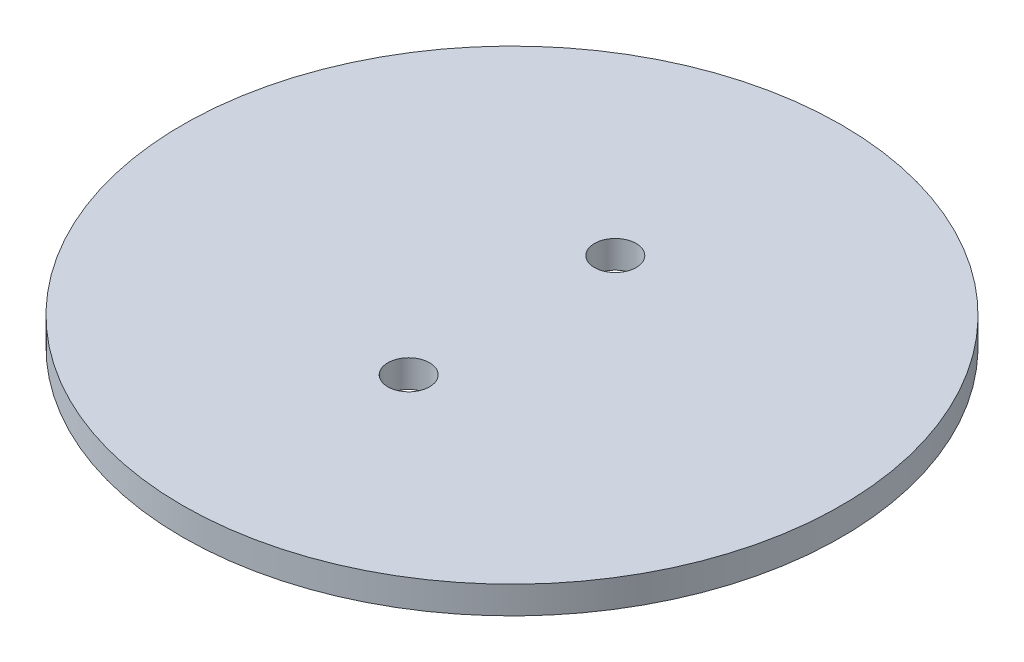
ISO-10303-21;
HEADER;
FILE_DESCRIPTION(('STEP AP214'),'2;1');
FILE_NAME('part.step','',(''),(''),'','','');
FILE_SCHEMA(('AUTOMOTIVE_DESIGN { 1 0 10303 214 1 1 1 1 }'));
ENDSEC;
DATA;
#1=APPLICATION_CONTEXT('core data for automotive mechanical design processes');
#2=APPLICATION_PROTOCOL_DEFINITION('international standard','automotive_design',2000,#1);
#3=PRODUCT_CONTEXT('',#1,'mechanical');
#4=PRODUCT('Part','Part','',(#3));
#5=PRODUCT_RELATED_PRODUCT_CATEGORY('part','',(#4));
#6=PRODUCT_DEFINITION_FORMATION('','',#4);
#7=PRODUCT_DEFINITION_CONTEXT('part definition',#1,'design');
#8=PRODUCT_DEFINITION('design','',#6,#7);
#9=PRODUCT_DEFINITION_SHAPE('','',#8);
#10=(LENGTH_UNIT() NAMED_UNIT(*) SI_UNIT(.MILLI.,.METRE.));
#11=(NAMED_UNIT(*) PLANE_ANGLE_UNIT() SI_UNIT($,.RADIAN.));
#12=(NAMED_UNIT(*) SI_UNIT($,.STERADIAN.) SOLID_ANGLE_UNIT());
#13=UNCERTAINTY_MEASURE_WITH_UNIT(LENGTH_MEASURE(1.E-05),#10,'distance_accuracy_value','');
#14=(GEOMETRIC_REPRESENTATION_CONTEXT(3) GLOBAL_UNCERTAINTY_ASSIGNED_CONTEXT((#13)) GLOBAL_UNIT_ASSIGNED_CONTEXT((#10,
#11,#12)) REPRESENTATION_CONTEXT('',''));
#15=CARTESIAN_POINT('',(0.,0.,0.));
#16=DIRECTION('',(0.,0.,1.));
#17=DIRECTION('',(1.,0.,0.));
#18=AXIS2_PLACEMENT_3D('',#15,#16,#17);
#19=CARTESIAN_POINT('',(0.,6.35,0.));
#20=DIRECTION('',(0.,-1.,0.));
#21=DIRECTION('',(0.,0.,-1.));
#22=AXIS2_PLACEMENT_3D('',#19,#20,#21);
#23=CYLINDRICAL_SURFACE('',#22,76.1746);
#24=CARTESIAN_POINT('',(0.,6.35,0.));
#25=DIRECTION('',(0.,1.,0.));
#26=DIRECTION('',(0.,0.,1.));
#27=AXIS2_PLACEMENT_3D('',#24,#25,#26);
#28=CIRCLE('',#27,76.1746);
#29=CARTESIAN_POINT('',(0.,6.35,76.1746));
#30=VERTEX_POINT('',#29);
#31=EDGE_CURVE('E10',#30,#30,#28,.T.);
#32=ORIENTED_EDGE('',*,*,#31,.F.);
#33=EDGE_LOOP('',(#32));
#34=FACE_BOUND('',#33,.T.);
#35=CARTESIAN_POINT('',(0.,0.,0.));
#36=DIRECTION('',(0.,1.,0.));
#37=DIRECTION('',(0.,0.,1.));
#38=AXIS2_PLACEMENT_3D('',#35,#36,#37);
#39=CIRCLE('',#38,76.1746);
#40=CARTESIAN_POINT('',(0.,0.,76.1746));
#41=VERTEX_POINT('',#40);
#42=EDGE_CURVE('E38',#41,#41,#39,.T.);
#43=ORIENTED_EDGE('',*,*,#42,.T.);
#44=EDGE_LOOP('',(#43));
#45=FACE_BOUND('',#44,.T.);
#46=ADVANCED_FACE('F31',(#34,#45),#23,.T.);
#47=CARTESIAN_POINT('',(0.,6.35,0.));
#48=DIRECTION('',(0.,1.,0.));
#49=DIRECTION('',(0.,0.,1.));
#50=AXIS2_PLACEMENT_3D('',#47,#48,#49);
#51=PLANE('',#50);
#52=CARTESIAN_POINT('',(0.,6.35,-23.876));
#53=DIRECTION('',(0.,1.,0.));
#54=DIRECTION('',(0.,0.,1.));
#55=AXIS2_PLACEMENT_3D('',#52,#53,#54);
#56=CIRCLE('',#55,4.826);
#57=CARTESIAN_POINT('',(0.,6.35,-19.05));
#58=VERTEX_POINT('',#57);
#59=EDGE_CURVE('E49',#58,#58,#56,.T.);
#60=ORIENTED_EDGE('',*,*,#59,.F.);
#61=EDGE_LOOP('',(#60));
#62=FACE_BOUND('',#61,.T.);
#63=CARTESIAN_POINT('',(0.,6.35,23.876));
#64=DIRECTION('',(0.,1.,0.));
#65=DIRECTION('',(0.,0.,1.));
#66=AXIS2_PLACEMENT_3D('',#63,#64,#65);
#67=CIRCLE('',#66,4.826);
#68=CARTESIAN_POINT('',(0.,6.35,28.702));
#69=VERTEX_POINT('',#68);
#70=EDGE_CURVE('E45',#69,#69,#67,.T.);
#71=ORIENTED_EDGE('',*,*,#70,.F.);
#72=EDGE_LOOP('',(#71));
#73=FACE_BOUND('',#72,.T.);
#74=ORIENTED_EDGE('',*,*,#31,.T.);
#75=EDGE_LOOP('',(#74));
#76=FACE_BOUND('',#75,.T.);
#77=ADVANCED_FACE('F62',(#62,#73,#76),#51,.T.);
#78=CARTESIAN_POINT('',(0.,0.,0.));
#79=DIRECTION('',(0.,1.,0.));
#80=DIRECTION('',(0.,0.,1.));
#81=AXIS2_PLACEMENT_3D('',#78,#79,#80);
#82=PLANE('',#81);
#83=CARTESIAN_POINT('',(0.,0.,-23.876));
#84=DIRECTION('',(0.,1.,0.));
#85=DIRECTION('',(0.,0.,1.));
#86=AXIS2_PLACEMENT_3D('',#83,#84,#85);
#87=CIRCLE('',#86,4.826);
#88=CARTESIAN_POINT('',(0.,0.,-19.05));
#89=VERTEX_POINT('',#88);
#90=EDGE_CURVE('E34',#89,#89,#87,.T.);
#91=ORIENTED_EDGE('',*,*,#90,.T.);
#92=EDGE_LOOP('',(#91));
#93=FACE_BOUND('',#92,.T.);
#94=CARTESIAN_POINT('',(0.,0.,23.876));
#95=DIRECTION('',(0.,1.,0.));
#96=DIRECTION('',(0.,0.,1.));
#97=AXIS2_PLACEMENT_3D('',#94,#95,#96);
#98=CIRCLE('',#97,4.826);
#99=CARTESIAN_POINT('',(0.,0.,28.702));
#100=VERTEX_POINT('',#99);
#101=EDGE_CURVE('E47',#100,#100,#98,.T.);
#102=ORIENTED_EDGE('',*,*,#101,.T.);
#103=EDGE_LOOP('',(#102));
#104=FACE_BOUND('',#103,.T.);
#105=ORIENTED_EDGE('',*,*,#42,.F.);
#106=EDGE_LOOP('',(#105));
#107=FACE_BOUND('',#106,.T.);
#108=ADVANCED_FACE('F64',(#93,#104,#107),#82,.F.);
#109=CARTESIAN_POINT('',(0.,-12.446,23.876));
#110=DIRECTION('',(0.,1.,0.));
#111=DIRECTION('',(0.,0.,1.));
#112=AXIS2_PLACEMENT_3D('',#109,#110,#111);
#113=CYLINDRICAL_SURFACE('',#112,4.826);
#114=ORIENTED_EDGE('',*,*,#70,.T.);
#115=EDGE_LOOP('',(#114));
#116=FACE_BOUND('',#115,.T.);
#117=ORIENTED_EDGE('',*,*,#101,.F.);
#118=EDGE_LOOP('',(#117));
#119=FACE_BOUND('',#118,.T.);
#120=ADVANCED_FACE('F59',(#116,#119),#113,.F.);
#121=CARTESIAN_POINT('',(0.,-12.446,-23.876));
#122=DIRECTION('',(0.,1.,0.));
#123=DIRECTION('',(0.,0.,1.));
#124=AXIS2_PLACEMENT_3D('',#121,#122,#123);
#125=CYLINDRICAL_SURFACE('',#124,4.826);
#126=ORIENTED_EDGE('',*,*,#59,.T.);
#127=EDGE_LOOP('',(#126));
#128=FACE_BOUND('',#127,.T.);
#129=ORIENTED_EDGE('',*,*,#90,.F.);
#130=EDGE_LOOP('',(#129));
#131=FACE_BOUND('',#130,.T.);
#132=ADVANCED_FACE('F76',(#128,#131),#125,.F.);
#133=CLOSED_SHELL('',(#46,#77,#108,#120,#132));
#134=MANIFOLD_SOLID_BREP('B2',#133);
#135=ADVANCED_BREP_SHAPE_REPRESENTATION('',(#18,#134),#14);
#136=SHAPE_DEFINITION_REPRESENTATION(#9,#135);
ENDSEC;
END-ISO-10303-21;
